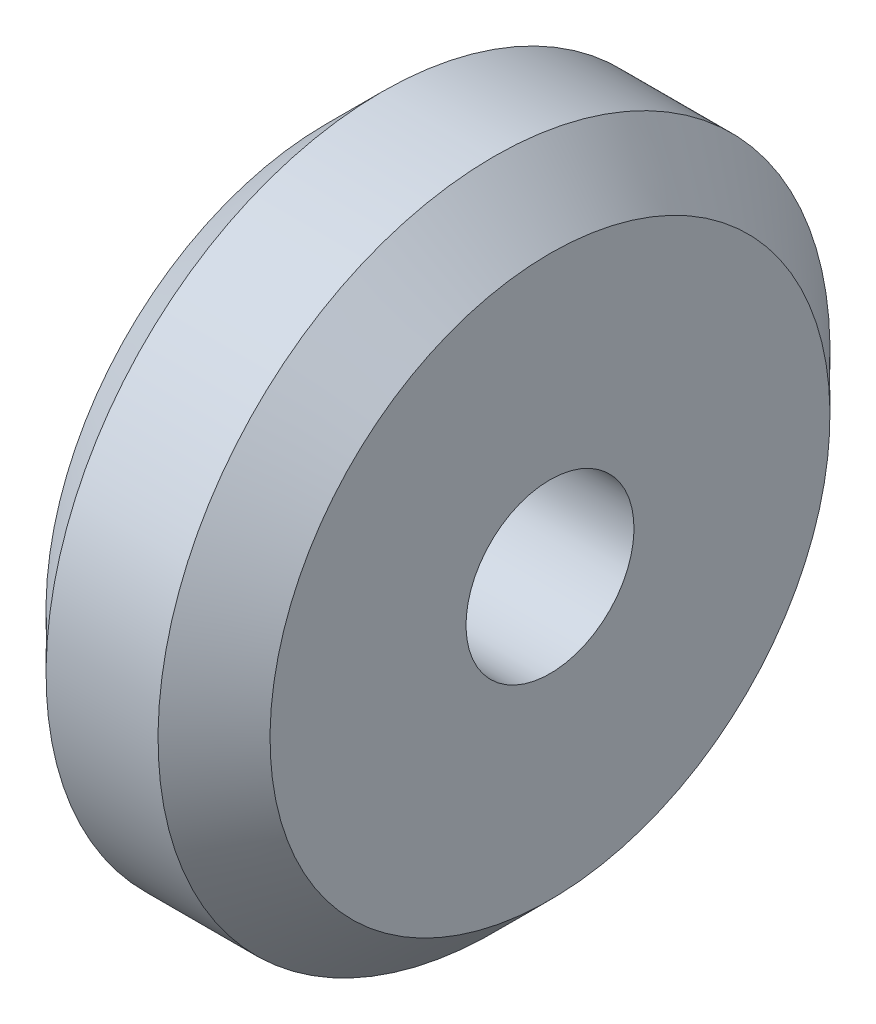
ISO-10303-21;
HEADER;
FILE_DESCRIPTION(('STEP AP214'),'2;1');
FILE_NAME('part.step','',(''),(''),'','','');
FILE_SCHEMA(('AUTOMOTIVE_DESIGN { 1 0 10303 214 1 1 1 1 }'));
ENDSEC;
DATA;
#1=APPLICATION_CONTEXT('core data for automotive mechanical design processes');
#2=APPLICATION_PROTOCOL_DEFINITION('international standard','automotive_design',2000,#1);
#3=PRODUCT_CONTEXT('',#1,'mechanical');
#4=PRODUCT('Part','Part','',(#3));
#5=PRODUCT_RELATED_PRODUCT_CATEGORY('part','',(#4));
#6=PRODUCT_DEFINITION_FORMATION('','',#4);
#7=PRODUCT_DEFINITION_CONTEXT('part definition',#1,'design');
#8=PRODUCT_DEFINITION('design','',#6,#7);
#9=PRODUCT_DEFINITION_SHAPE('','',#8);
#10=(LENGTH_UNIT() NAMED_UNIT(*) SI_UNIT(.MILLI.,.METRE.));
#11=(NAMED_UNIT(*) PLANE_ANGLE_UNIT() SI_UNIT($,.RADIAN.));
#12=(NAMED_UNIT(*) SI_UNIT($,.STERADIAN.) SOLID_ANGLE_UNIT());
#13=UNCERTAINTY_MEASURE_WITH_UNIT(LENGTH_MEASURE(1.E-05),#10,'distance_accuracy_value','');
#14=(GEOMETRIC_REPRESENTATION_CONTEXT(3) GLOBAL_UNCERTAINTY_ASSIGNED_CONTEXT((#13)) GLOBAL_UNIT_ASSIGNED_CONTEXT((#10,
#11,#12)) REPRESENTATION_CONTEXT('',''));
#15=CARTESIAN_POINT('',(0.,0.,0.));
#16=DIRECTION('',(0.,0.,1.));
#17=DIRECTION('',(1.,0.,0.));
#18=AXIS2_PLACEMENT_3D('',#15,#16,#17);
#19=CARTESIAN_POINT('',(0.,0.,0.));
#20=DIRECTION('',(-1.,0.,0.));
#21=DIRECTION('',(0.,-1.,0.));
#22=AXIS2_PLACEMENT_3D('',#19,#20,#21);
#23=PLANE('',#22);
#24=CARTESIAN_POINT('',(0.,0.,0.));
#25=DIRECTION('',(-1.,0.,0.));
#26=DIRECTION('',(0.,-1.,0.));
#27=AXIS2_PLACEMENT_3D('',#24,#25,#26);
#28=CIRCLE('',#27,3.);
#29=CARTESIAN_POINT('',(0.,-3.,0.));
#30=VERTEX_POINT('',#29);
#31=EDGE_CURVE('E53',#30,#30,#28,.T.);
#32=ORIENTED_EDGE('',*,*,#31,.F.);
#33=EDGE_LOOP('',(#32));
#34=FACE_BOUND('',#33,.T.);
#35=CARTESIAN_POINT('',(0.,0.,0.));
#36=DIRECTION('',(1.,0.,0.));
#37=DIRECTION('',(0.,1.,0.));
#38=AXIS2_PLACEMENT_3D('',#35,#36,#37);
#39=CIRCLE('',#38,10.);
#40=CARTESIAN_POINT('',(0.,10.,0.));
#41=VERTEX_POINT('',#40);
#42=EDGE_CURVE('E10',#41,#41,#39,.T.);
#43=ORIENTED_EDGE('',*,*,#42,.F.);
#44=EDGE_LOOP('',(#43));
#45=FACE_BOUND('',#44,.T.);
#46=ADVANCED_FACE('F34',(#34,#45),#23,.T.);
#47=CARTESIAN_POINT('',(1.99999999999995,0.,0.));
#48=DIRECTION('',(1.,0.,0.));
#49=DIRECTION('',(0.,1.,0.));
#50=AXIS2_PLACEMENT_3D('',#47,#48,#49);
#51=CONICAL_SURFACE('',#50,12.,0.78539816339746);
#52=ORIENTED_EDGE('',*,*,#42,.T.);
#53=EDGE_LOOP('',(#52));
#54=FACE_BOUND('',#53,.T.);
#55=CARTESIAN_POINT('',(1.99999999999995,0.,0.));
#56=DIRECTION('',(1.,0.,0.));
#57=DIRECTION('',(0.,1.,0.));
#58=AXIS2_PLACEMENT_3D('',#55,#56,#57);
#59=CIRCLE('',#58,12.);
#60=CARTESIAN_POINT('',(1.99999999999995,12.,0.));
#61=VERTEX_POINT('',#60);
#62=EDGE_CURVE('E40',#61,#61,#59,.T.);
#63=ORIENTED_EDGE('',*,*,#62,.F.);
#64=EDGE_LOOP('',(#63));
#65=FACE_BOUND('',#64,.T.);
#66=ADVANCED_FACE('F76',(#54,#65),#51,.T.);
#67=CARTESIAN_POINT('',(8.,0.,0.));
#68=DIRECTION('',(1.,0.,0.));
#69=DIRECTION('',(0.,1.,0.));
#70=AXIS2_PLACEMENT_3D('',#67,#68,#69);
#71=CYLINDRICAL_SURFACE('',#70,12.);
#72=ORIENTED_EDGE('',*,*,#62,.T.);
#73=EDGE_LOOP('',(#72));
#74=FACE_BOUND('',#73,.T.);
#75=CARTESIAN_POINT('',(5.99999999999995,0.,0.));
#76=DIRECTION('',(1.,0.,0.));
#77=DIRECTION('',(0.,1.,0.));
#78=AXIS2_PLACEMENT_3D('',#75,#76,#77);
#79=CIRCLE('',#78,12.);
#80=CARTESIAN_POINT('',(5.99999999999995,12.,0.));
#81=VERTEX_POINT('',#80);
#82=EDGE_CURVE('E44',#81,#81,#79,.T.);
#83=ORIENTED_EDGE('',*,*,#82,.F.);
#84=EDGE_LOOP('',(#83));
#85=FACE_BOUND('',#84,.T.);
#86=ADVANCED_FACE('F70',(#74,#85),#71,.T.);
#87=CARTESIAN_POINT('',(8.,0.,0.));
#88=DIRECTION('',(-1.,0.,0.));
#89=DIRECTION('',(0.,-1.,0.));
#90=AXIS2_PLACEMENT_3D('',#87,#88,#89);
#91=CONICAL_SURFACE('',#90,10.,0.785398163397436);
#92=ORIENTED_EDGE('',*,*,#82,.T.);
#93=EDGE_LOOP('',(#92));
#94=FACE_BOUND('',#93,.T.);
#95=CARTESIAN_POINT('',(8.,0.,0.));
#96=DIRECTION('',(1.,0.,0.));
#97=DIRECTION('',(0.,1.,0.));
#98=AXIS2_PLACEMENT_3D('',#95,#96,#97);
#99=CIRCLE('',#98,10.);
#100=CARTESIAN_POINT('',(8.,10.,0.));
#101=VERTEX_POINT('',#100);
#102=EDGE_CURVE('E48',#101,#101,#99,.T.);
#103=ORIENTED_EDGE('',*,*,#102,.F.);
#104=EDGE_LOOP('',(#103));
#105=FACE_BOUND('',#104,.T.);
#106=ADVANCED_FACE('F65',(#94,#105),#91,.T.);
#107=CARTESIAN_POINT('',(8.,10.,0.));
#108=DIRECTION('',(1.,0.,0.));
#109=DIRECTION('',(0.,1.,0.));
#110=AXIS2_PLACEMENT_3D('',#107,#108,#109);
#111=PLANE('',#110);
#112=CARTESIAN_POINT('',(8.,0.,0.));
#113=DIRECTION('',(1.,0.,0.));
#114=DIRECTION('',(0.,1.,0.));
#115=AXIS2_PLACEMENT_3D('',#112,#113,#114);
#116=CIRCLE('',#115,3.);
#117=CARTESIAN_POINT('',(8.,3.,0.));
#118=VERTEX_POINT('',#117);
#119=EDGE_CURVE('E56',#118,#118,#116,.T.);
#120=ORIENTED_EDGE('',*,*,#119,.F.);
#121=EDGE_LOOP('',(#120));
#122=FACE_BOUND('',#121,.T.);
#123=ORIENTED_EDGE('',*,*,#102,.T.);
#124=EDGE_LOOP('',(#123));
#125=FACE_BOUND('',#124,.T.);
#126=ADVANCED_FACE('F62',(#122,#125),#111,.T.);
#127=CARTESIAN_POINT('',(-2.,0.,0.));
#128=DIRECTION('',(1.,0.,0.));
#129=DIRECTION('',(0.,1.,0.));
#130=AXIS2_PLACEMENT_3D('',#127,#128,#129);
#131=CYLINDRICAL_SURFACE('',#130,3.);
#132=ORIENTED_EDGE('',*,*,#31,.T.);
#133=EDGE_LOOP('',(#132));
#134=FACE_BOUND('',#133,.T.);
#135=ORIENTED_EDGE('',*,*,#119,.T.);
#136=EDGE_LOOP('',(#135));
#137=FACE_BOUND('',#136,.T.);
#138=ADVANCED_FACE('F60',(#134,#137),#131,.F.);
#139=CLOSED_SHELL('',(#46,#66,#86,#106,#126,#138));
#140=MANIFOLD_SOLID_BREP('B2',#139);
#141=ADVANCED_BREP_SHAPE_REPRESENTATION('',(#18,#140),#14);
#142=SHAPE_DEFINITION_REPRESENTATION(#9,#141);
ENDSEC;
END-ISO-10303-21;
